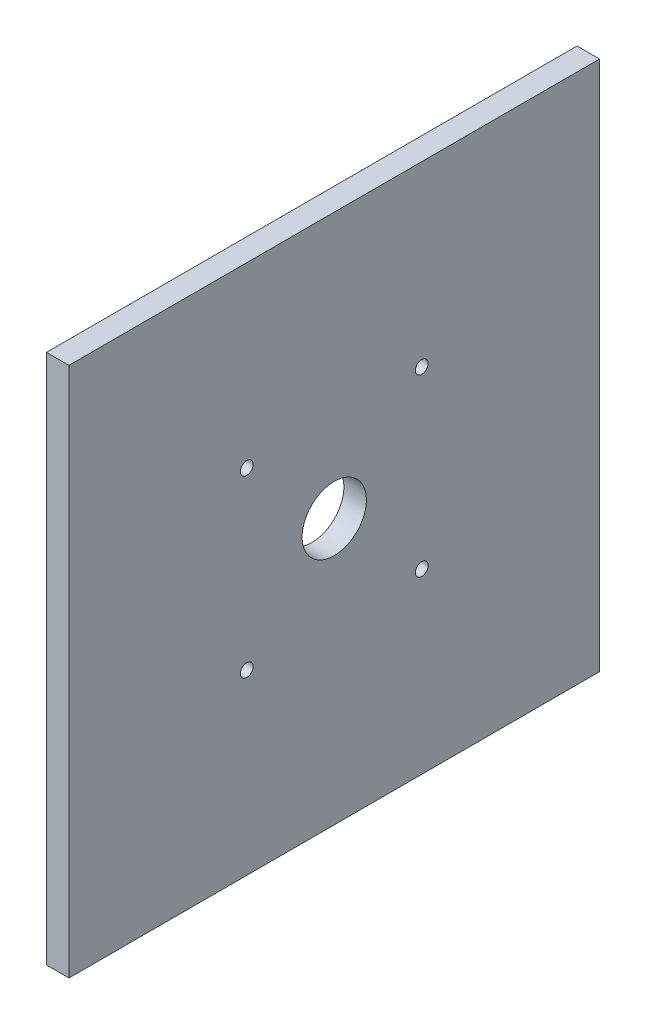
ISO-10303-21;
HEADER;
FILE_DESCRIPTION(('STEP AP214'),'2;1');
FILE_NAME('part.step','',(''),(''),'','','');
FILE_SCHEMA(('AUTOMOTIVE_DESIGN { 1 0 10303 214 1 1 1 1 }'));
ENDSEC;
DATA;
#1=APPLICATION_CONTEXT('core data for automotive mechanical design processes');
#2=APPLICATION_PROTOCOL_DEFINITION('international standard','automotive_design',2000,#1);
#3=PRODUCT_CONTEXT('',#1,'mechanical');
#4=PRODUCT('Part','Part','',(#3));
#5=PRODUCT_RELATED_PRODUCT_CATEGORY('part','',(#4));
#6=PRODUCT_DEFINITION_FORMATION('','',#4);
#7=PRODUCT_DEFINITION_CONTEXT('part definition',#1,'design');
#8=PRODUCT_DEFINITION('design','',#6,#7);
#9=PRODUCT_DEFINITION_SHAPE('','',#8);
#10=(LENGTH_UNIT() NAMED_UNIT(*) SI_UNIT(.MILLI.,.METRE.));
#11=(NAMED_UNIT(*) PLANE_ANGLE_UNIT() SI_UNIT($,.RADIAN.));
#12=(NAMED_UNIT(*) SI_UNIT($,.STERADIAN.) SOLID_ANGLE_UNIT());
#13=UNCERTAINTY_MEASURE_WITH_UNIT(LENGTH_MEASURE(1.E-05),#10,'distance_accuracy_value','');
#14=(GEOMETRIC_REPRESENTATION_CONTEXT(3) GLOBAL_UNCERTAINTY_ASSIGNED_CONTEXT((#13)) GLOBAL_UNIT_ASSIGNED_CONTEXT((#10,
#11,#12)) REPRESENTATION_CONTEXT('',''));
#15=CARTESIAN_POINT('',(0.,0.,0.));
#16=DIRECTION('',(0.,0.,1.));
#17=DIRECTION('',(1.,0.,0.));
#18=AXIS2_PLACEMENT_3D('',#15,#16,#17);
#19=CARTESIAN_POINT('',(1.4,0.,0.));
#20=DIRECTION('',(-1.,0.,0.));
#21=DIRECTION('',(0.,0.,1.));
#22=AXIS2_PLACEMENT_3D('',#19,#20,#21);
#23=PLANE('',#22);
#24=DIRECTION('',(0.,1.,0.));
#25=VECTOR('',#24,1.);
#26=CARTESIAN_POINT('',(1.4,-16.5,-16.5));
#27=LINE('',#26,#25);
#28=CARTESIAN_POINT('',(1.4,-16.5,-16.5));
#29=VERTEX_POINT('',#28);
#30=CARTESIAN_POINT('',(1.4,16.5,-16.5));
#31=VERTEX_POINT('',#30);
#32=EDGE_CURVE('E89',#29,#31,#27,.T.);
#33=ORIENTED_EDGE('',*,*,#32,.T.);
#34=DIRECTION('',(0.,0.,1.));
#35=VECTOR('',#34,1.);
#36=CARTESIAN_POINT('',(1.4,16.5,16.5));
#37=LINE('',#36,#35);
#38=CARTESIAN_POINT('',(1.4,16.5,16.5));
#39=VERTEX_POINT('',#38);
#40=EDGE_CURVE('E84',#31,#39,#37,.T.);
#41=ORIENTED_EDGE('',*,*,#40,.T.);
#42=DIRECTION('',(0.,-1.,0.));
#43=VECTOR('',#42,1.);
#44=CARTESIAN_POINT('',(1.4,-16.5,16.5));
#45=LINE('',#44,#43);
#46=CARTESIAN_POINT('',(1.4,-16.5,16.5));
#47=VERTEX_POINT('',#46);
#48=EDGE_CURVE('E87',#39,#47,#45,.T.);
#49=ORIENTED_EDGE('',*,*,#48,.T.);
#50=DIRECTION('',(0.,0.,-1.));
#51=VECTOR('',#50,1.);
#52=CARTESIAN_POINT('',(1.4,-16.5,16.5));
#53=LINE('',#52,#51);
#54=EDGE_CURVE('E54',#47,#29,#53,.T.);
#55=ORIENTED_EDGE('',*,*,#54,.T.);
#56=EDGE_LOOP('',(#33,#41,#49,#55));
#57=FACE_BOUND('',#56,.T.);
#58=CARTESIAN_POINT('',(1.4,0.,0.));
#59=DIRECTION('',(1.,0.,0.));
#60=DIRECTION('',(0.,0.,-1.));
#61=AXIS2_PLACEMENT_3D('',#58,#59,#60);
#62=CIRCLE('',#61,2.);
#63=CARTESIAN_POINT('',(1.4,0.,-2.));
#64=VERTEX_POINT('',#63);
#65=EDGE_CURVE('E104',#64,#64,#62,.T.);
#66=ORIENTED_EDGE('',*,*,#65,.F.);
#67=EDGE_LOOP('',(#66));
#68=FACE_BOUND('',#67,.T.);
#69=CARTESIAN_POINT('',(1.4,-5.44145935531453,-5.44145935531445));
#70=DIRECTION('',(1.,0.,0.));
#71=DIRECTION('',(0.,0.,-1.));
#72=AXIS2_PLACEMENT_3D('',#69,#70,#71);
#73=CIRCLE('',#72,0.4);
#74=CARTESIAN_POINT('',(1.4,-5.44145935531453,-5.84145935531445));
#75=VERTEX_POINT('',#74);
#76=EDGE_CURVE('E119',#75,#75,#73,.T.);
#77=ORIENTED_EDGE('',*,*,#76,.F.);
#78=EDGE_LOOP('',(#77));
#79=FACE_BOUND('',#78,.T.);
#80=CARTESIAN_POINT('',(1.4,-5.44145935531443,5.44145935531455));
#81=DIRECTION('',(1.,0.,0.));
#82=DIRECTION('',(0.,0.,-1.));
#83=AXIS2_PLACEMENT_3D('',#80,#81,#82);
#84=CIRCLE('',#83,0.400000000000001);
#85=CARTESIAN_POINT('',(1.4,-5.44145935531443,5.04145935531454));
#86=VERTEX_POINT('',#85);
#87=EDGE_CURVE('E126',#86,#86,#84,.T.);
#88=ORIENTED_EDGE('',*,*,#87,.F.);
#89=EDGE_LOOP('',(#88));
#90=FACE_BOUND('',#89,.T.);
#91=CARTESIAN_POINT('',(1.4,5.44145935531457,5.44145935531441));
#92=DIRECTION('',(1.,0.,0.));
#93=DIRECTION('',(0.,0.,-1.));
#94=AXIS2_PLACEMENT_3D('',#91,#92,#93);
#95=CIRCLE('',#94,0.400000000000001);
#96=CARTESIAN_POINT('',(1.4,5.44145935531457,5.04145935531441));
#97=VERTEX_POINT('',#96);
#98=EDGE_CURVE('E133',#97,#97,#95,.T.);
#99=ORIENTED_EDGE('',*,*,#98,.F.);
#100=EDGE_LOOP('',(#99));
#101=FACE_BOUND('',#100,.T.);
#102=CARTESIAN_POINT('',(1.4,5.44145935531439,-5.44145935531458));
#103=DIRECTION('',(1.,0.,0.));
#104=DIRECTION('',(0.,0.,-1.));
#105=AXIS2_PLACEMENT_3D('',#102,#103,#104);
#106=CIRCLE('',#105,0.400000000000001);
#107=CARTESIAN_POINT('',(1.4,5.44145935531439,-5.84145935531459));
#108=VERTEX_POINT('',#107);
#109=EDGE_CURVE('E139',#108,#108,#106,.T.);
#110=ORIENTED_EDGE('',*,*,#109,.F.);
#111=EDGE_LOOP('',(#110));
#112=FACE_BOUND('',#111,.T.);
#113=ADVANCED_FACE('F37',(#57,#68,#79,#90,#101,#112),#23,.F.);
#114=CARTESIAN_POINT('',(0.,0.,0.));
#115=DIRECTION('',(-1.,0.,0.));
#116=DIRECTION('',(0.,0.,1.));
#117=AXIS2_PLACEMENT_3D('',#114,#115,#116);
#118=PLANE('',#117);
#119=CARTESIAN_POINT('',(0.,5.44145935531457,5.44145935531441));
#120=DIRECTION('',(1.,0.,0.));
#121=DIRECTION('',(0.,0.,-1.));
#122=AXIS2_PLACEMENT_3D('',#119,#120,#121);
#123=CIRCLE('',#122,0.400000000000001);
#124=CARTESIAN_POINT('',(0.,5.44145935531457,5.04145935531441));
#125=VERTEX_POINT('',#124);
#126=EDGE_CURVE('E136',#125,#125,#123,.T.);
#127=ORIENTED_EDGE('',*,*,#126,.T.);
#128=EDGE_LOOP('',(#127));
#129=FACE_BOUND('',#128,.T.);
#130=CARTESIAN_POINT('',(0.,-5.44145935531453,-5.44145935531445));
#131=DIRECTION('',(1.,0.,0.));
#132=DIRECTION('',(0.,0.,-1.));
#133=AXIS2_PLACEMENT_3D('',#130,#131,#132);
#134=CIRCLE('',#133,0.4);
#135=CARTESIAN_POINT('',(0.,-5.44145935531453,-5.84145935531445));
#136=VERTEX_POINT('',#135);
#137=EDGE_CURVE('E122',#136,#136,#134,.T.);
#138=ORIENTED_EDGE('',*,*,#137,.T.);
#139=EDGE_LOOP('',(#138));
#140=FACE_BOUND('',#139,.T.);
#141=DIRECTION('',(0.,1.,0.));
#142=VECTOR('',#141,1.);
#143=CARTESIAN_POINT('',(0.,-16.5,-16.5));
#144=LINE('',#143,#142);
#145=CARTESIAN_POINT('',(0.,-16.5,-16.5));
#146=VERTEX_POINT('',#145);
#147=CARTESIAN_POINT('',(0.,16.5,-16.5));
#148=VERTEX_POINT('',#147);
#149=EDGE_CURVE('E101',#146,#148,#144,.T.);
#150=ORIENTED_EDGE('',*,*,#149,.F.);
#151=DIRECTION('',(0.,0.,-1.));
#152=VECTOR('',#151,1.);
#153=CARTESIAN_POINT('',(0.,-16.5,16.5));
#154=LINE('',#153,#152);
#155=CARTESIAN_POINT('',(0.,-16.5,16.5));
#156=VERTEX_POINT('',#155);
#157=EDGE_CURVE('E77',#156,#146,#154,.T.);
#158=ORIENTED_EDGE('',*,*,#157,.F.);
#159=DIRECTION('',(0.,-1.,0.));
#160=VECTOR('',#159,1.);
#161=CARTESIAN_POINT('',(0.,-16.5,16.5));
#162=LINE('',#161,#160);
#163=CARTESIAN_POINT('',(0.,16.5,16.5));
#164=VERTEX_POINT('',#163);
#165=EDGE_CURVE('E71',#164,#156,#162,.T.);
#166=ORIENTED_EDGE('',*,*,#165,.F.);
#167=DIRECTION('',(0.,0.,1.));
#168=VECTOR('',#167,1.);
#169=CARTESIAN_POINT('',(0.,16.5,16.5));
#170=LINE('',#169,#168);
#171=EDGE_CURVE('E93',#148,#164,#170,.T.);
#172=ORIENTED_EDGE('',*,*,#171,.F.);
#173=EDGE_LOOP('',(#150,#158,#166,#172));
#174=FACE_BOUND('',#173,.T.);
#175=CARTESIAN_POINT('',(0.,0.,0.));
#176=DIRECTION('',(1.,0.,0.));
#177=DIRECTION('',(0.,0.,-1.));
#178=AXIS2_PLACEMENT_3D('',#175,#176,#177);
#179=CIRCLE('',#178,2.);
#180=CARTESIAN_POINT('',(0.,0.,-2.));
#181=VERTEX_POINT('',#180);
#182=EDGE_CURVE('E116',#181,#181,#179,.T.);
#183=ORIENTED_EDGE('',*,*,#182,.T.);
#184=EDGE_LOOP('',(#183));
#185=FACE_BOUND('',#184,.T.);
#186=CARTESIAN_POINT('',(0.,-5.44145935531443,5.44145935531455));
#187=DIRECTION('',(1.,0.,0.));
#188=DIRECTION('',(0.,0.,-1.));
#189=AXIS2_PLACEMENT_3D('',#186,#187,#188);
#190=CIRCLE('',#189,0.400000000000001);
#191=CARTESIAN_POINT('',(0.,-5.44145935531443,5.04145935531454));
#192=VERTEX_POINT('',#191);
#193=EDGE_CURVE('E130',#192,#192,#190,.T.);
#194=ORIENTED_EDGE('',*,*,#193,.T.);
#195=EDGE_LOOP('',(#194));
#196=FACE_BOUND('',#195,.T.);
#197=CARTESIAN_POINT('',(0.,5.44145935531439,-5.44145935531458));
#198=DIRECTION('',(1.,0.,0.));
#199=DIRECTION('',(0.,0.,-1.));
#200=AXIS2_PLACEMENT_3D('',#197,#198,#199);
#201=CIRCLE('',#200,0.400000000000001);
#202=CARTESIAN_POINT('',(0.,5.44145935531439,-5.84145935531459));
#203=VERTEX_POINT('',#202);
#204=EDGE_CURVE('E142',#203,#203,#201,.T.);
#205=ORIENTED_EDGE('',*,*,#204,.T.);
#206=EDGE_LOOP('',(#205));
#207=FACE_BOUND('',#206,.T.);
#208=ADVANCED_FACE('F112',(#129,#140,#174,#185,#196,#207),#118,.T.);
#209=CARTESIAN_POINT('',(1.4,-16.5,-16.5));
#210=DIRECTION('',(0.,0.,1.));
#211=DIRECTION('',(1.,0.,0.));
#212=AXIS2_PLACEMENT_3D('',#209,#210,#211);
#213=PLANE('',#212);
#214=ORIENTED_EDGE('',*,*,#149,.T.);
#215=DIRECTION('',(-1.,0.,0.));
#216=VECTOR('',#215,1.);
#217=CARTESIAN_POINT('',(1.4,16.5,-16.5));
#218=LINE('',#217,#216);
#219=EDGE_CURVE('E11',#31,#148,#218,.T.);
#220=ORIENTED_EDGE('',*,*,#219,.F.);
#221=ORIENTED_EDGE('',*,*,#32,.F.);
#222=DIRECTION('',(-1.,0.,0.));
#223=VECTOR('',#222,1.);
#224=CARTESIAN_POINT('',(1.4,-16.5,-16.5));
#225=LINE('',#224,#223);
#226=EDGE_CURVE('E97',#29,#146,#225,.T.);
#227=ORIENTED_EDGE('',*,*,#226,.T.);
#228=EDGE_LOOP('',(#214,#220,#221,#227));
#229=FACE_BOUND('',#228,.T.);
#230=ADVANCED_FACE('F39',(#229),#213,.F.);
#231=CARTESIAN_POINT('',(1.4,16.5,16.5));
#232=DIRECTION('',(0.,-1.,0.));
#233=DIRECTION('',(0.,0.,-1.));
#234=AXIS2_PLACEMENT_3D('',#231,#232,#233);
#235=PLANE('',#234);
#236=ORIENTED_EDGE('',*,*,#171,.T.);
#237=DIRECTION('',(-1.,0.,0.));
#238=VECTOR('',#237,1.);
#239=CARTESIAN_POINT('',(1.4,16.5,16.5));
#240=LINE('',#239,#238);
#241=EDGE_CURVE('E46',#39,#164,#240,.T.);
#242=ORIENTED_EDGE('',*,*,#241,.F.);
#243=ORIENTED_EDGE('',*,*,#40,.F.);
#244=ORIENTED_EDGE('',*,*,#219,.T.);
#245=EDGE_LOOP('',(#236,#242,#243,#244));
#246=FACE_BOUND('',#245,.T.);
#247=ADVANCED_FACE('F92',(#246),#235,.F.);
#248=CARTESIAN_POINT('',(1.4,-16.5,16.5));
#249=DIRECTION('',(0.,0.,-1.));
#250=DIRECTION('',(-1.,0.,0.));
#251=AXIS2_PLACEMENT_3D('',#248,#249,#250);
#252=PLANE('',#251);
#253=ORIENTED_EDGE('',*,*,#165,.T.);
#254=DIRECTION('',(-1.,0.,0.));
#255=VECTOR('',#254,1.);
#256=CARTESIAN_POINT('',(1.4,-16.5,16.5));
#257=LINE('',#256,#255);
#258=EDGE_CURVE('E94',#47,#156,#257,.T.);
#259=ORIENTED_EDGE('',*,*,#258,.F.);
#260=ORIENTED_EDGE('',*,*,#48,.F.);
#261=ORIENTED_EDGE('',*,*,#241,.T.);
#262=EDGE_LOOP('',(#253,#259,#260,#261));
#263=FACE_BOUND('',#262,.T.);
#264=ADVANCED_FACE('F95',(#263),#252,.F.);
#265=CARTESIAN_POINT('',(1.4,-16.5,16.5));
#266=DIRECTION('',(0.,1.,0.));
#267=DIRECTION('',(0.,0.,1.));
#268=AXIS2_PLACEMENT_3D('',#265,#266,#267);
#269=PLANE('',#268);
#270=ORIENTED_EDGE('',*,*,#157,.T.);
#271=ORIENTED_EDGE('',*,*,#226,.F.);
#272=ORIENTED_EDGE('',*,*,#54,.F.);
#273=ORIENTED_EDGE('',*,*,#258,.T.);
#274=EDGE_LOOP('',(#270,#271,#272,#273));
#275=FACE_BOUND('',#274,.T.);
#276=ADVANCED_FACE('F109',(#275),#269,.F.);
#277=CARTESIAN_POINT('',(1.4,0.,0.));
#278=DIRECTION('',(-1.,0.,0.));
#279=DIRECTION('',(0.,0.,1.));
#280=AXIS2_PLACEMENT_3D('',#277,#278,#279);
#281=CYLINDRICAL_SURFACE('',#280,2.);
#282=ORIENTED_EDGE('',*,*,#65,.T.);
#283=EDGE_LOOP('',(#282));
#284=FACE_BOUND('',#283,.T.);
#285=ORIENTED_EDGE('',*,*,#182,.F.);
#286=EDGE_LOOP('',(#285));
#287=FACE_BOUND('',#286,.T.);
#288=ADVANCED_FACE('F159',(#284,#287),#281,.F.);
#289=CARTESIAN_POINT('',(1.4,-5.44145935531453,-5.44145935531445));
#290=DIRECTION('',(-1.,0.,0.));
#291=DIRECTION('',(0.,0.,1.));
#292=AXIS2_PLACEMENT_3D('',#289,#290,#291);
#293=CYLINDRICAL_SURFACE('',#292,0.4);
#294=ORIENTED_EDGE('',*,*,#76,.T.);
#295=EDGE_LOOP('',(#294));
#296=FACE_BOUND('',#295,.T.);
#297=ORIENTED_EDGE('',*,*,#137,.F.);
#298=EDGE_LOOP('',(#297));
#299=FACE_BOUND('',#298,.T.);
#300=ADVANCED_FACE('F207',(#296,#299),#293,.F.);
#301=CARTESIAN_POINT('',(1.4,-5.44145935531443,5.44145935531455));
#302=DIRECTION('',(-1.,0.,0.));
#303=DIRECTION('',(0.,0.,1.));
#304=AXIS2_PLACEMENT_3D('',#301,#302,#303);
#305=CYLINDRICAL_SURFACE('',#304,0.400000000000001);
#306=ORIENTED_EDGE('',*,*,#87,.T.);
#307=EDGE_LOOP('',(#306));
#308=FACE_BOUND('',#307,.T.);
#309=ORIENTED_EDGE('',*,*,#193,.F.);
#310=EDGE_LOOP('',(#309));
#311=FACE_BOUND('',#310,.T.);
#312=ADVANCED_FACE('F215',(#308,#311),#305,.F.);
#313=CARTESIAN_POINT('',(1.4,5.44145935531457,5.44145935531441));
#314=DIRECTION('',(-1.,0.,0.));
#315=DIRECTION('',(0.,0.,1.));
#316=AXIS2_PLACEMENT_3D('',#313,#314,#315);
#317=CYLINDRICAL_SURFACE('',#316,0.400000000000001);
#318=ORIENTED_EDGE('',*,*,#98,.T.);
#319=EDGE_LOOP('',(#318));
#320=FACE_BOUND('',#319,.T.);
#321=ORIENTED_EDGE('',*,*,#126,.F.);
#322=EDGE_LOOP('',(#321));
#323=FACE_BOUND('',#322,.T.);
#324=ADVANCED_FACE('F223',(#320,#323),#317,.F.);
#325=CARTESIAN_POINT('',(1.4,5.44145935531439,-5.44145935531458));
#326=DIRECTION('',(-1.,0.,0.));
#327=DIRECTION('',(0.,0.,1.));
#328=AXIS2_PLACEMENT_3D('',#325,#326,#327);
#329=CYLINDRICAL_SURFACE('',#328,0.400000000000001);
#330=ORIENTED_EDGE('',*,*,#109,.T.);
#331=EDGE_LOOP('',(#330));
#332=FACE_BOUND('',#331,.T.);
#333=ORIENTED_EDGE('',*,*,#204,.F.);
#334=EDGE_LOOP('',(#333));
#335=FACE_BOUND('',#334,.T.);
#336=ADVANCED_FACE('F148',(#332,#335),#329,.F.);
#337=CLOSED_SHELL('',(#113,#208,#230,#247,#264,#276,#288,#300,#312,#324,#336));
#338=MANIFOLD_SOLID_BREP('B2',#337);
#339=ADVANCED_BREP_SHAPE_REPRESENTATION('',(#18,#338),#14);
#340=SHAPE_DEFINITION_REPRESENTATION(#9,#339);
ENDSEC;
END-ISO-10303-21;
